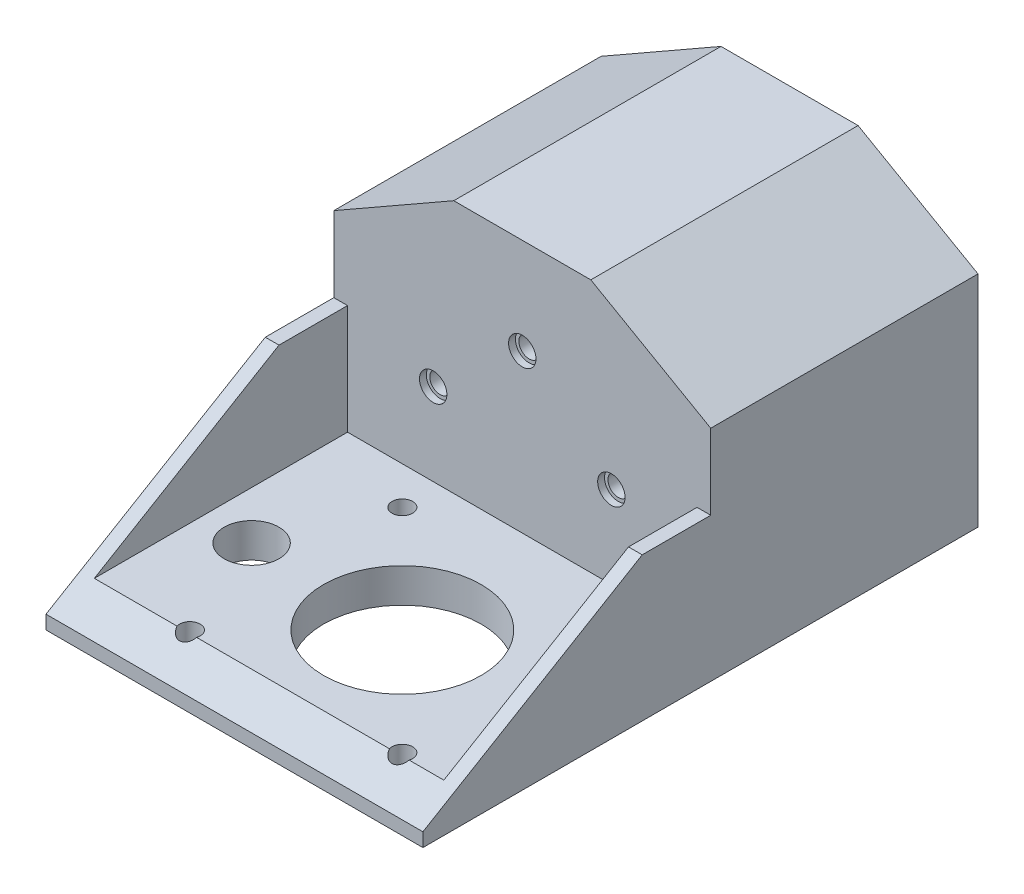
ISO-10303-21;
HEADER;
FILE_DESCRIPTION(('STEP AP214'),'2;1');
FILE_NAME('part.step','',(''),(''),'','','');
FILE_SCHEMA(('AUTOMOTIVE_DESIGN { 1 0 10303 214 1 1 1 1 }'));
ENDSEC;
DATA;
#1=APPLICATION_CONTEXT('core data for automotive mechanical design processes');
#2=APPLICATION_PROTOCOL_DEFINITION('international standard','automotive_design',2000,#1);
#3=PRODUCT_CONTEXT('',#1,'mechanical');
#4=PRODUCT('Part','Part','',(#3));
#5=PRODUCT_RELATED_PRODUCT_CATEGORY('part','',(#4));
#6=PRODUCT_DEFINITION_FORMATION('','',#4);
#7=PRODUCT_DEFINITION_CONTEXT('part definition',#1,'design');
#8=PRODUCT_DEFINITION('design','',#6,#7);
#9=PRODUCT_DEFINITION_SHAPE('','',#8);
#10=(LENGTH_UNIT() NAMED_UNIT(*) SI_UNIT(.MILLI.,.METRE.));
#11=(NAMED_UNIT(*) PLANE_ANGLE_UNIT() SI_UNIT($,.RADIAN.));
#12=(NAMED_UNIT(*) SI_UNIT($,.STERADIAN.) SOLID_ANGLE_UNIT());
#13=UNCERTAINTY_MEASURE_WITH_UNIT(LENGTH_MEASURE(1.E-05),#10,'distance_accuracy_value','');
#14=(GEOMETRIC_REPRESENTATION_CONTEXT(3) GLOBAL_UNCERTAINTY_ASSIGNED_CONTEXT((#13)) GLOBAL_UNIT_ASSIGNED_CONTEXT((#10,
#11,#12)) REPRESENTATION_CONTEXT('',''));
#15=CARTESIAN_POINT('',(0.,0.,0.));
#16=DIRECTION('',(0.,0.,1.));
#17=DIRECTION('',(1.,0.,0.));
#18=AXIS2_PLACEMENT_3D('',#15,#16,#17);
#19=CARTESIAN_POINT('',(0.,0.,39.));
#20=DIRECTION('',(0.,0.,1.));
#21=DIRECTION('',(1.,0.,0.));
#22=AXIS2_PLACEMENT_3D('',#19,#20,#21);
#23=PLANE('',#22);
#24=CARTESIAN_POINT('',(27.5000000000002,28.,39.));
#25=DIRECTION('',(0.,0.,1.));
#26=DIRECTION('',(1.,0.,0.));
#27=AXIS2_PLACEMENT_3D('',#24,#25,#26);
#28=CIRCLE('',#27,2.);
#29=CARTESIAN_POINT('',(29.5000000000002,28.,39.));
#30=VERTEX_POINT('',#29);
#31=EDGE_CURVE('E440',#30,#30,#28,.T.);
#32=ORIENTED_EDGE('',*,*,#31,.F.);
#33=EDGE_LOOP('',(#32));
#34=FACE_BOUND('',#33,.T.);
#35=CARTESIAN_POINT('',(40.5000000000002,17.,39.));
#36=DIRECTION('',(0.,0.,1.));
#37=DIRECTION('',(1.,0.,0.));
#38=AXIS2_PLACEMENT_3D('',#35,#36,#37);
#39=CIRCLE('',#38,2.);
#40=CARTESIAN_POINT('',(42.5000000000002,17.,39.));
#41=VERTEX_POINT('',#40);
#42=EDGE_CURVE('E448',#41,#41,#39,.T.);
#43=ORIENTED_EDGE('',*,*,#42,.F.);
#44=EDGE_LOOP('',(#43));
#45=FACE_BOUND('',#44,.T.);
#46=CARTESIAN_POINT('',(14.5,17.,39.));
#47=DIRECTION('',(0.,0.,1.));
#48=DIRECTION('',(1.,0.,0.));
#49=AXIS2_PLACEMENT_3D('',#46,#47,#48);
#50=CIRCLE('',#49,2.);
#51=CARTESIAN_POINT('',(16.5,17.,39.));
#52=VERTEX_POINT('',#51);
#53=EDGE_CURVE('E436',#52,#52,#50,.T.);
#54=ORIENTED_EDGE('',*,*,#53,.F.);
#55=EDGE_LOOP('',(#54));
#56=FACE_BOUND('',#55,.T.);
#57=DIRECTION('',(-1.,0.,0.));
#58=VECTOR('',#57,1.);
#59=CARTESIAN_POINT('',(55.0000000000002,5.,39.));
#60=LINE('',#59,#58);
#61=CARTESIAN_POINT('',(53.0000000000002,5.,39.));
#62=VERTEX_POINT('',#61);
#63=CARTESIAN_POINT('',(2.,4.99999999999999,39.));
#64=VERTEX_POINT('',#63);
#65=EDGE_CURVE('E180',#62,#64,#60,.T.);
#66=ORIENTED_EDGE('',*,*,#65,.F.);
#67=DIRECTION('',(0.,-1.,0.));
#68=VECTOR('',#67,1.);
#69=CARTESIAN_POINT('',(53.0000000000002,21.,39.));
#70=LINE('',#69,#68);
#71=CARTESIAN_POINT('',(53.0000000000002,21.,39.));
#72=VERTEX_POINT('',#71);
#73=EDGE_CURVE('E391',#72,#62,#70,.T.);
#74=ORIENTED_EDGE('',*,*,#73,.F.);
#75=DIRECTION('',(-1.,0.,0.));
#76=VECTOR('',#75,1.);
#77=CARTESIAN_POINT('',(55.0000000000002,21.,39.));
#78=LINE('',#77,#76);
#79=CARTESIAN_POINT('',(55.0000000000002,21.,39.));
#80=VERTEX_POINT('',#79);
#81=EDGE_CURVE('E412',#80,#72,#78,.T.);
#82=ORIENTED_EDGE('',*,*,#81,.F.);
#83=DIRECTION('',(0.,1.,0.));
#84=VECTOR('',#83,1.);
#85=CARTESIAN_POINT('',(55.0000000000002,0.,39.));
#86=LINE('',#85,#84);
#87=CARTESIAN_POINT('',(55.0000000000002,32.,39.));
#88=VERTEX_POINT('',#87);
#89=EDGE_CURVE('E98',#80,#88,#86,.T.);
#90=ORIENTED_EDGE('',*,*,#89,.T.);
#91=DIRECTION('',(-0.868243142124462,0.496138938356834,0.));
#92=VECTOR('',#91,1.);
#93=CARTESIAN_POINT('',(55.0000000000002,32.,39.));
#94=LINE('',#93,#92);
#95=CARTESIAN_POINT('',(37.5000000000002,42.,39.));
#96=VERTEX_POINT('',#95);
#97=EDGE_CURVE('E201',#88,#96,#94,.T.);
#98=ORIENTED_EDGE('',*,*,#97,.T.);
#99=DIRECTION('',(-1.,0.,0.));
#100=VECTOR('',#99,1.);
#101=CARTESIAN_POINT('',(37.5000000000002,42.,39.));
#102=LINE('',#101,#100);
#103=CARTESIAN_POINT('',(17.5,42.,39.));
#104=VERTEX_POINT('',#103);
#105=EDGE_CURVE('E204',#96,#104,#102,.T.);
#106=ORIENTED_EDGE('',*,*,#105,.T.);
#107=DIRECTION('',(-0.868243142124462,-0.496138938356834,0.));
#108=VECTOR('',#107,1.);
#109=CARTESIAN_POINT('',(17.5,42.,39.));
#110=LINE('',#109,#108);
#111=CARTESIAN_POINT('',(0.,32.,39.));
#112=VERTEX_POINT('',#111);
#113=EDGE_CURVE('E64',#104,#112,#110,.T.);
#114=ORIENTED_EDGE('',*,*,#113,.T.);
#115=DIRECTION('',(0.,-1.,0.));
#116=VECTOR('',#115,1.);
#117=CARTESIAN_POINT('',(0.,32.,39.));
#118=LINE('',#117,#116);
#119=CARTESIAN_POINT('',(0.,21.,39.));
#120=VERTEX_POINT('',#119);
#121=EDGE_CURVE('E196',#112,#120,#118,.T.);
#122=ORIENTED_EDGE('',*,*,#121,.T.);
#123=DIRECTION('',(-1.,0.,0.));
#124=VECTOR('',#123,1.);
#125=CARTESIAN_POINT('',(0.,21.,39.));
#126=LINE('',#125,#124);
#127=CARTESIAN_POINT('',(2.,21.,39.));
#128=VERTEX_POINT('',#127);
#129=EDGE_CURVE('E429',#128,#120,#126,.T.);
#130=ORIENTED_EDGE('',*,*,#129,.F.);
#131=DIRECTION('',(0.,-1.,0.));
#132=VECTOR('',#131,1.);
#133=CARTESIAN_POINT('',(2.,21.,39.));
#134=LINE('',#133,#132);
#135=EDGE_CURVE('E394',#128,#64,#134,.T.);
#136=ORIENTED_EDGE('',*,*,#135,.T.);
#137=EDGE_LOOP('',(#66,#74,#82,#90,#98,#106,#114,#122,#130,#136));
#138=FACE_BOUND('',#137,.T.);
#139=ADVANCED_FACE('F40',(#34,#45,#56,#138),#23,.T.);
#140=CARTESIAN_POINT('',(55.0000000000002,5.,81.0000000000001));
#141=DIRECTION('',(0.,-1.,0.));
#142=DIRECTION('',(1.,0.,0.));
#143=AXIS2_PLACEMENT_3D('',#140,#141,#142);
#144=PLANE('',#143);
#145=CARTESIAN_POINT('',(9.00000000000001,4.99999999999999,60.0000000000001));
#146=DIRECTION('',(0.,1.,0.));
#147=DIRECTION('',(-1.,0.,0.));
#148=AXIS2_PLACEMENT_3D('',#145,#146,#147);
#149=CIRCLE('',#148,4.00000000000001);
#150=CARTESIAN_POINT('',(4.99999999999999,4.99999999999999,60.0000000000001));
#151=VERTEX_POINT('',#150);
#152=EDGE_CURVE('E310',#151,#151,#149,.T.);
#153=ORIENTED_EDGE('',*,*,#152,.F.);
#154=EDGE_LOOP('',(#153));
#155=FACE_BOUND('',#154,.T.);
#156=DIRECTION('',(0.,0.,-1.));
#157=VECTOR('',#156,1.);
#158=CARTESIAN_POINT('',(2.,4.99999999999999,39.));
#159=LINE('',#158,#157);
#160=CARTESIAN_POINT('',(2.,4.99999999999999,75.9473684210527));
#161=VERTEX_POINT('',#160);
#162=EDGE_CURVE('E399',#161,#64,#159,.T.);
#163=ORIENTED_EDGE('',*,*,#162,.F.);
#164=DIRECTION('',(1.,0.,0.));
#165=VECTOR('',#164,1.);
#166=CARTESIAN_POINT('',(55.0000000000002,5.,75.9473684210527));
#167=LINE('',#166,#165);
#168=CARTESIAN_POINT('',(14.0682662622384,4.99999999999999,75.9473684210527));
#169=VERTEX_POINT('',#168);
#170=EDGE_CURVE('E743',#161,#169,#167,.T.);
#171=ORIENTED_EDGE('',*,*,#170,.T.);
#172=CARTESIAN_POINT('',(15.5,4.99999999999999,75.5));
#173=DIRECTION('',(0.,1.,0.));
#174=DIRECTION('',(-1.,0.,0.));
#175=AXIS2_PLACEMENT_3D('',#172,#173,#174);
#176=CIRCLE('',#175,1.5);
#177=CARTESIAN_POINT('',(16.9317337377616,4.99999999999999,75.9473684210527));
#178=VERTEX_POINT('',#177);
#179=EDGE_CURVE('E302',#178,#169,#176,.T.);
#180=ORIENTED_EDGE('',*,*,#179,.F.);
#181=CARTESIAN_POINT('',(45.0682662622385,5.,75.9473684210527));
#182=VERTEX_POINT('',#181);
#183=EDGE_CURVE('E748',#178,#182,#167,.T.);
#184=ORIENTED_EDGE('',*,*,#183,.T.);
#185=CARTESIAN_POINT('',(46.5000000000001,5.,75.5));
#186=DIRECTION('',(0.,1.,0.));
#187=DIRECTION('',(-1.,0.,0.));
#188=AXIS2_PLACEMENT_3D('',#185,#186,#187);
#189=CIRCLE('',#188,1.5);
#190=CARTESIAN_POINT('',(47.9317337377618,5.,75.9473684210527));
#191=VERTEX_POINT('',#190);
#192=EDGE_CURVE('E294',#191,#182,#189,.T.);
#193=ORIENTED_EDGE('',*,*,#192,.F.);
#194=CARTESIAN_POINT('',(53.0000000000002,5.,75.9473684210527));
#195=VERTEX_POINT('',#194);
#196=EDGE_CURVE('E404',#191,#195,#167,.T.);
#197=ORIENTED_EDGE('',*,*,#196,.T.);
#198=DIRECTION('',(0.,0.,1.));
#199=VECTOR('',#198,1.);
#200=CARTESIAN_POINT('',(53.0000000000002,5.,39.));
#201=LINE('',#200,#199);
#202=EDGE_CURVE('E402',#62,#195,#201,.T.);
#203=ORIENTED_EDGE('',*,*,#202,.F.);
#204=ORIENTED_EDGE('',*,*,#65,.T.);
#205=EDGE_LOOP('',(#163,#171,#180,#184,#193,#197,#203,#204));
#206=FACE_BOUND('',#205,.T.);
#207=CARTESIAN_POINT('',(46.5000000000001,5.,44.5));
#208=DIRECTION('',(0.,1.,0.));
#209=DIRECTION('',(-1.,0.,0.));
#210=AXIS2_PLACEMENT_3D('',#207,#208,#209);
#211=CIRCLE('',#210,1.5);
#212=CARTESIAN_POINT('',(45.0000000000001,5.,44.5));
#213=VERTEX_POINT('',#212);
#214=EDGE_CURVE('E286',#213,#213,#211,.T.);
#215=ORIENTED_EDGE('',*,*,#214,.F.);
#216=EDGE_LOOP('',(#215));
#217=FACE_BOUND('',#216,.T.);
#218=CARTESIAN_POINT('',(15.5,4.99999999999999,44.5));
#219=DIRECTION('',(0.,1.,0.));
#220=DIRECTION('',(-1.,0.,0.));
#221=AXIS2_PLACEMENT_3D('',#218,#219,#220);
#222=CIRCLE('',#221,1.5);
#223=CARTESIAN_POINT('',(14.,4.99999999999999,44.5));
#224=VERTEX_POINT('',#223);
#225=EDGE_CURVE('E278',#224,#224,#222,.T.);
#226=ORIENTED_EDGE('',*,*,#225,.F.);
#227=EDGE_LOOP('',(#226));
#228=FACE_BOUND('',#227,.T.);
#229=CARTESIAN_POINT('',(31.0000000000002,4.99999999999999,60.0000000000001));
#230=DIRECTION('',(0.,1.,0.));
#231=DIRECTION('',(-1.,0.,0.));
#232=AXIS2_PLACEMENT_3D('',#229,#230,#231);
#233=CIRCLE('',#232,11.5);
#234=CARTESIAN_POINT('',(19.5000000000001,4.99999999999999,60.0000000000001));
#235=VERTEX_POINT('',#234);
#236=EDGE_CURVE('E190',#235,#235,#233,.T.);
#237=ORIENTED_EDGE('',*,*,#236,.F.);
#238=EDGE_LOOP('',(#237));
#239=FACE_BOUND('',#238,.T.);
#240=ADVANCED_FACE('F325',(#155,#206,#217,#228,#239),#144,.F.);
#241=CARTESIAN_POINT('',(14.5,17.,0.));
#242=DIRECTION('',(0.,0.,1.));
#243=DIRECTION('',(1.,0.,0.));
#244=AXIS2_PLACEMENT_3D('',#241,#242,#243);
#245=CYLINDRICAL_SURFACE('',#244,1.5);
#246=CARTESIAN_POINT('',(14.5,17.,0.));
#247=DIRECTION('',(0.,0.,1.));
#248=DIRECTION('',(-1.,0.,0.));
#249=AXIS2_PLACEMENT_3D('',#246,#247,#248);
#250=CIRCLE('',#249,1.5);
#251=CARTESIAN_POINT('',(13.,17.,0.));
#252=VERTEX_POINT('',#251);
#253=EDGE_CURVE('E257',#252,#252,#250,.T.);
#254=ORIENTED_EDGE('',*,*,#253,.F.);
#255=EDGE_LOOP('',(#254));
#256=FACE_BOUND('',#255,.T.);
#257=CARTESIAN_POINT('',(14.5,17.,38.));
#258=DIRECTION('',(0.,0.,1.));
#259=DIRECTION('',(1.,0.,0.));
#260=AXIS2_PLACEMENT_3D('',#257,#258,#259);
#261=CIRCLE('',#260,1.5);
#262=CARTESIAN_POINT('',(16.,17.,38.));
#263=VERTEX_POINT('',#262);
#264=EDGE_CURVE('E254',#263,#263,#261,.F.);
#265=ORIENTED_EDGE('',*,*,#264,.F.);
#266=EDGE_LOOP('',(#265));
#267=FACE_BOUND('',#266,.T.);
#268=ADVANCED_FACE('F327',(#256,#267),#245,.F.);
#269=CARTESIAN_POINT('',(40.5000000000002,17.,0.));
#270=DIRECTION('',(0.,0.,1.));
#271=DIRECTION('',(1.,0.,0.));
#272=AXIS2_PLACEMENT_3D('',#269,#270,#271);
#273=CYLINDRICAL_SURFACE('',#272,1.5);
#274=CARTESIAN_POINT('',(40.5000000000002,17.,0.));
#275=DIRECTION('',(0.,0.,1.));
#276=DIRECTION('',(1.,0.,0.));
#277=AXIS2_PLACEMENT_3D('',#274,#275,#276);
#278=CIRCLE('',#277,1.5);
#279=CARTESIAN_POINT('',(42.0000000000002,17.,0.));
#280=VERTEX_POINT('',#279);
#281=EDGE_CURVE('E263',#280,#280,#278,.T.);
#282=ORIENTED_EDGE('',*,*,#281,.F.);
#283=EDGE_LOOP('',(#282));
#284=FACE_BOUND('',#283,.T.);
#285=CARTESIAN_POINT('',(40.5000000000002,17.,38.));
#286=DIRECTION('',(0.,0.,1.));
#287=DIRECTION('',(1.,0.,0.));
#288=AXIS2_PLACEMENT_3D('',#285,#286,#287);
#289=CIRCLE('',#288,1.5);
#290=CARTESIAN_POINT('',(42.0000000000002,17.,38.));
#291=VERTEX_POINT('',#290);
#292=EDGE_CURVE('E250',#291,#291,#289,.F.);
#293=ORIENTED_EDGE('',*,*,#292,.F.);
#294=EDGE_LOOP('',(#293));
#295=FACE_BOUND('',#294,.T.);
#296=ADVANCED_FACE('F334',(#284,#295),#273,.F.);
#297=CARTESIAN_POINT('',(27.5000000000002,28.,0.));
#298=DIRECTION('',(0.,0.,1.));
#299=DIRECTION('',(1.,0.,0.));
#300=AXIS2_PLACEMENT_3D('',#297,#298,#299);
#301=CYLINDRICAL_SURFACE('',#300,1.5);
#302=CARTESIAN_POINT('',(27.5000000000002,28.,0.));
#303=DIRECTION('',(0.,0.,1.));
#304=DIRECTION('',(1.,0.,0.));
#305=AXIS2_PLACEMENT_3D('',#302,#303,#304);
#306=CIRCLE('',#305,1.5);
#307=CARTESIAN_POINT('',(29.0000000000002,28.,0.));
#308=VERTEX_POINT('',#307);
#309=EDGE_CURVE('E270',#308,#308,#306,.T.);
#310=ORIENTED_EDGE('',*,*,#309,.F.);
#311=EDGE_LOOP('',(#310));
#312=FACE_BOUND('',#311,.T.);
#313=CARTESIAN_POINT('',(27.5000000000002,28.,38.));
#314=DIRECTION('',(0.,0.,1.));
#315=DIRECTION('',(1.,0.,0.));
#316=AXIS2_PLACEMENT_3D('',#313,#314,#315);
#317=CIRCLE('',#316,1.5);
#318=CARTESIAN_POINT('',(29.0000000000002,28.,38.));
#319=VERTEX_POINT('',#318);
#320=EDGE_CURVE('E246',#319,#319,#317,.F.);
#321=ORIENTED_EDGE('',*,*,#320,.F.);
#322=EDGE_LOOP('',(#321));
#323=FACE_BOUND('',#322,.T.);
#324=ADVANCED_FACE('F366',(#312,#323),#301,.F.);
#325=CARTESIAN_POINT('',(0.,32.,39.));
#326=DIRECTION('',(1.,0.,0.));
#327=DIRECTION('',(0.,1.,0.));
#328=AXIS2_PLACEMENT_3D('',#325,#326,#327);
#329=PLANE('',#328);
#330=DIRECTION('',(0.,-1.,0.));
#331=VECTOR('',#330,1.);
#332=CARTESIAN_POINT('',(0.,4.99999999999999,81.0000000000001));
#333=LINE('',#332,#331);
#334=CARTESIAN_POINT('',(0.,2.,81.0000000000001));
#335=VERTEX_POINT('',#334);
#336=CARTESIAN_POINT('',(0.,0.,81.0000000000001));
#337=VERTEX_POINT('',#336);
#338=EDGE_CURVE('E179',#335,#337,#333,.T.);
#339=ORIENTED_EDGE('',*,*,#338,.F.);
#340=DIRECTION('',(0.,0.510538754155436,-0.859854743840737));
#341=VECTOR('',#340,1.);
#342=CARTESIAN_POINT('',(0.,28.2570397111913,36.7776173285198));
#343=LINE('',#342,#341);
#344=CARTESIAN_POINT('',(0.,21.,49.));
#345=VERTEX_POINT('',#344);
#346=EDGE_CURVE('E158',#335,#345,#343,.T.);
#347=ORIENTED_EDGE('',*,*,#346,.T.);
#348=DIRECTION('',(0.,0.,1.));
#349=VECTOR('',#348,1.);
#350=CARTESIAN_POINT('',(0.,21.,39.));
#351=LINE('',#350,#349);
#352=EDGE_CURVE('E422',#120,#345,#351,.T.);
#353=ORIENTED_EDGE('',*,*,#352,.F.);
#354=ORIENTED_EDGE('',*,*,#121,.F.);
#355=DIRECTION('',(0.,0.,-1.));
#356=VECTOR('',#355,1.);
#357=CARTESIAN_POINT('',(0.,32.,39.));
#358=LINE('',#357,#356);
#359=CARTESIAN_POINT('',(0.,32.,0.));
#360=VERTEX_POINT('',#359);
#361=EDGE_CURVE('E209',#112,#360,#358,.T.);
#362=ORIENTED_EDGE('',*,*,#361,.T.);
#363=DIRECTION('',(0.,-1.,0.));
#364=VECTOR('',#363,1.);
#365=CARTESIAN_POINT('',(0.,32.,0.));
#366=LINE('',#365,#364);
#367=CARTESIAN_POINT('',(0.,0.,0.));
#368=VERTEX_POINT('',#367);
#369=EDGE_CURVE('E194',#360,#368,#366,.T.);
#370=ORIENTED_EDGE('',*,*,#369,.T.);
#371=DIRECTION('',(0.,0.,-1.));
#372=VECTOR('',#371,1.);
#373=CARTESIAN_POINT('',(0.,0.,39.));
#374=LINE('',#373,#372);
#375=EDGE_CURVE('E49',#337,#368,#374,.T.);
#376=ORIENTED_EDGE('',*,*,#375,.F.);
#377=EDGE_LOOP('',(#339,#347,#353,#354,#362,#370,#376));
#378=FACE_BOUND('',#377,.T.);
#379=ADVANCED_FACE('F42',(#378),#329,.F.);
#380=CARTESIAN_POINT('',(0.,0.,39.));
#381=DIRECTION('',(0.,1.,0.));
#382=DIRECTION('',(0.,0.,1.));
#383=AXIS2_PLACEMENT_3D('',#380,#381,#382);
#384=PLANE('',#383);
#385=CARTESIAN_POINT('',(9.00000000000001,0.,60.0000000000001));
#386=DIRECTION('',(0.,1.,0.));
#387=DIRECTION('',(-1.,0.,0.));
#388=AXIS2_PLACEMENT_3D('',#385,#386,#387);
#389=CIRCLE('',#388,4.00000000000001);
#390=CARTESIAN_POINT('',(4.99999999999999,0.,60.0000000000001));
#391=VERTEX_POINT('',#390);
#392=EDGE_CURVE('E306',#391,#391,#389,.T.);
#393=ORIENTED_EDGE('',*,*,#392,.T.);
#394=EDGE_LOOP('',(#393));
#395=FACE_BOUND('',#394,.T.);
#396=CARTESIAN_POINT('',(15.5,0.,75.5));
#397=DIRECTION('',(0.,1.,0.));
#398=DIRECTION('',(-1.,0.,0.));
#399=AXIS2_PLACEMENT_3D('',#396,#397,#398);
#400=CIRCLE('',#399,1.5);
#401=CARTESIAN_POINT('',(14.,0.,75.5));
#402=VERTEX_POINT('',#401);
#403=EDGE_CURVE('E298',#402,#402,#400,.T.);
#404=ORIENTED_EDGE('',*,*,#403,.T.);
#405=EDGE_LOOP('',(#404));
#406=FACE_BOUND('',#405,.T.);
#407=CARTESIAN_POINT('',(46.5000000000001,0.,75.5));
#408=DIRECTION('',(0.,1.,0.));
#409=DIRECTION('',(-1.,0.,0.));
#410=AXIS2_PLACEMENT_3D('',#407,#408,#409);
#411=CIRCLE('',#410,1.5);
#412=CARTESIAN_POINT('',(45.0000000000001,0.,75.5));
#413=VERTEX_POINT('',#412);
#414=EDGE_CURVE('E290',#413,#413,#411,.T.);
#415=ORIENTED_EDGE('',*,*,#414,.T.);
#416=EDGE_LOOP('',(#415));
#417=FACE_BOUND('',#416,.T.);
#418=CARTESIAN_POINT('',(46.5000000000001,0.,44.5));
#419=DIRECTION('',(0.,1.,0.));
#420=DIRECTION('',(-1.,0.,0.));
#421=AXIS2_PLACEMENT_3D('',#418,#419,#420);
#422=CIRCLE('',#421,1.5);
#423=CARTESIAN_POINT('',(45.0000000000001,0.,44.5));
#424=VERTEX_POINT('',#423);
#425=EDGE_CURVE('E282',#424,#424,#422,.T.);
#426=ORIENTED_EDGE('',*,*,#425,.T.);
#427=EDGE_LOOP('',(#426));
#428=FACE_BOUND('',#427,.T.);
#429=CARTESIAN_POINT('',(15.5,0.,44.5));
#430=DIRECTION('',(0.,1.,0.));
#431=DIRECTION('',(-1.,0.,0.));
#432=AXIS2_PLACEMENT_3D('',#429,#430,#431);
#433=CIRCLE('',#432,1.5);
#434=CARTESIAN_POINT('',(14.,0.,44.5));
#435=VERTEX_POINT('',#434);
#436=EDGE_CURVE('E274',#435,#435,#433,.T.);
#437=ORIENTED_EDGE('',*,*,#436,.T.);
#438=EDGE_LOOP('',(#437));
#439=FACE_BOUND('',#438,.T.);
#440=CARTESIAN_POINT('',(31.0000000000002,0.,60.0000000000001));
#441=DIRECTION('',(0.,1.,0.));
#442=DIRECTION('',(-1.,0.,0.));
#443=AXIS2_PLACEMENT_3D('',#440,#441,#442);
#444=CIRCLE('',#443,11.5);
#445=CARTESIAN_POINT('',(19.5000000000001,0.,60.0000000000001));
#446=VERTEX_POINT('',#445);
#447=EDGE_CURVE('E187',#446,#446,#444,.T.);
#448=ORIENTED_EDGE('',*,*,#447,.T.);
#449=EDGE_LOOP('',(#448));
#450=FACE_BOUND('',#449,.T.);
#451=DIRECTION('',(1.,0.,0.));
#452=VECTOR('',#451,1.);
#453=CARTESIAN_POINT('',(0.,0.,0.));
#454=LINE('',#453,#452);
#455=CARTESIAN_POINT('',(55.0000000000002,0.,0.));
#456=VERTEX_POINT('',#455);
#457=EDGE_CURVE('E213',#368,#456,#454,.T.);
#458=ORIENTED_EDGE('',*,*,#457,.T.);
#459=DIRECTION('',(0.,0.,-1.));
#460=VECTOR('',#459,1.);
#461=CARTESIAN_POINT('',(55.0000000000002,0.,39.));
#462=LINE('',#461,#460);
#463=CARTESIAN_POINT('',(55.0000000000002,0.,81.0000000000001));
#464=VERTEX_POINT('',#463);
#465=EDGE_CURVE('E240',#464,#456,#462,.T.);
#466=ORIENTED_EDGE('',*,*,#465,.F.);
#467=DIRECTION('',(1.,0.,0.));
#468=VECTOR('',#467,1.);
#469=CARTESIAN_POINT('',(55.0000000000002,0.,81.0000000000001));
#470=LINE('',#469,#468);
#471=EDGE_CURVE('E177',#337,#464,#470,.T.);
#472=ORIENTED_EDGE('',*,*,#471,.F.);
#473=ORIENTED_EDGE('',*,*,#375,.T.);
#474=EDGE_LOOP('',(#458,#466,#472,#473));
#475=FACE_BOUND('',#474,.T.);
#476=ADVANCED_FACE('F360',(#395,#406,#417,#428,#439,#450,#475),#384,.F.);
#477=CARTESIAN_POINT('',(55.0000000000002,0.,39.));
#478=DIRECTION('',(-1.,0.,0.));
#479=DIRECTION('',(0.,0.,1.));
#480=AXIS2_PLACEMENT_3D('',#477,#478,#479);
#481=PLANE('',#480);
#482=DIRECTION('',(0.,0.,-1.));
#483=VECTOR('',#482,1.);
#484=CARTESIAN_POINT('',(55.0000000000002,21.,39.));
#485=LINE('',#484,#483);
#486=CARTESIAN_POINT('',(55.0000000000002,21.,49.));
#487=VERTEX_POINT('',#486);
#488=EDGE_CURVE('E171',#487,#80,#485,.T.);
#489=ORIENTED_EDGE('',*,*,#488,.F.);
#490=DIRECTION('',(0.,0.510538754155436,-0.859854743840737));
#491=VECTOR('',#490,1.);
#492=CARTESIAN_POINT('',(55.0000000000002,2.,81.0000000000001));
#493=LINE('',#492,#491);
#494=CARTESIAN_POINT('',(55.0000000000002,2.,81.0000000000001));
#495=VERTEX_POINT('',#494);
#496=EDGE_CURVE('E56',#495,#487,#493,.T.);
#497=ORIENTED_EDGE('',*,*,#496,.F.);
#498=DIRECTION('',(0.,1.,0.));
#499=VECTOR('',#498,1.);
#500=CARTESIAN_POINT('',(55.0000000000002,5.,81.0000000000001));
#501=LINE('',#500,#499);
#502=EDGE_CURVE('E170',#464,#495,#501,.T.);
#503=ORIENTED_EDGE('',*,*,#502,.F.);
#504=ORIENTED_EDGE('',*,*,#465,.T.);
#505=DIRECTION('',(0.,1.,0.));
#506=VECTOR('',#505,1.);
#507=CARTESIAN_POINT('',(55.0000000000002,0.,0.));
#508=LINE('',#507,#506);
#509=CARTESIAN_POINT('',(55.0000000000002,32.,0.));
#510=VERTEX_POINT('',#509);
#511=EDGE_CURVE('E216',#456,#510,#508,.T.);
#512=ORIENTED_EDGE('',*,*,#511,.T.);
#513=DIRECTION('',(0.,0.,-1.));
#514=VECTOR('',#513,1.);
#515=CARTESIAN_POINT('',(55.0000000000002,32.,39.));
#516=LINE('',#515,#514);
#517=EDGE_CURVE('E236',#88,#510,#516,.T.);
#518=ORIENTED_EDGE('',*,*,#517,.F.);
#519=ORIENTED_EDGE('',*,*,#89,.F.);
#520=EDGE_LOOP('',(#489,#497,#503,#504,#512,#518,#519));
#521=FACE_BOUND('',#520,.T.);
#522=ADVANCED_FACE('F168',(#521),#481,.F.);
#523=CARTESIAN_POINT('',(55.0000000000002,32.,39.));
#524=DIRECTION('',(-0.496138938356835,-0.868243142124459,0.));
#525=DIRECTION('',(0.868243142124462,-0.496138938356834,0.));
#526=AXIS2_PLACEMENT_3D('',#523,#524,#525);
#527=PLANE('',#526);
#528=DIRECTION('',(-0.868243142124462,0.496138938356834,0.));
#529=VECTOR('',#528,1.);
#530=CARTESIAN_POINT('',(55.0000000000002,32.,0.));
#531=LINE('',#530,#529);
#532=CARTESIAN_POINT('',(37.5000000000002,42.,0.));
#533=VERTEX_POINT('',#532);
#534=EDGE_CURVE('E219',#510,#533,#531,.T.);
#535=ORIENTED_EDGE('',*,*,#534,.T.);
#536=DIRECTION('',(0.,0.,-1.));
#537=VECTOR('',#536,1.);
#538=CARTESIAN_POINT('',(37.5000000000002,42.,39.));
#539=LINE('',#538,#537);
#540=EDGE_CURVE('E232',#96,#533,#539,.T.);
#541=ORIENTED_EDGE('',*,*,#540,.F.);
#542=ORIENTED_EDGE('',*,*,#97,.F.);
#543=ORIENTED_EDGE('',*,*,#517,.T.);
#544=EDGE_LOOP('',(#535,#541,#542,#543));
#545=FACE_BOUND('',#544,.T.);
#546=ADVANCED_FACE('F354',(#545),#527,.F.);
#547=CARTESIAN_POINT('',(37.5000000000002,42.,39.));
#548=DIRECTION('',(0.,-1.,0.));
#549=DIRECTION('',(0.,0.,-1.));
#550=AXIS2_PLACEMENT_3D('',#547,#548,#549);
#551=PLANE('',#550);
#552=DIRECTION('',(-1.,0.,0.));
#553=VECTOR('',#552,1.);
#554=CARTESIAN_POINT('',(37.5000000000002,42.,0.));
#555=LINE('',#554,#553);
#556=CARTESIAN_POINT('',(17.5,42.,0.));
#557=VERTEX_POINT('',#556);
#558=EDGE_CURVE('E222',#533,#557,#555,.T.);
#559=ORIENTED_EDGE('',*,*,#558,.T.);
#560=DIRECTION('',(0.,0.,-1.));
#561=VECTOR('',#560,1.);
#562=CARTESIAN_POINT('',(17.5,42.,39.));
#563=LINE('',#562,#561);
#564=EDGE_CURVE('E229',#104,#557,#563,.T.);
#565=ORIENTED_EDGE('',*,*,#564,.F.);
#566=ORIENTED_EDGE('',*,*,#105,.F.);
#567=ORIENTED_EDGE('',*,*,#540,.T.);
#568=EDGE_LOOP('',(#559,#565,#566,#567));
#569=FACE_BOUND('',#568,.T.);
#570=ADVANCED_FACE('F351',(#569),#551,.F.);
#571=CARTESIAN_POINT('',(17.5,42.,39.));
#572=DIRECTION('',(0.496138938356835,-0.868243142124459,0.));
#573=DIRECTION('',(0.868243142124462,0.496138938356834,0.));
#574=AXIS2_PLACEMENT_3D('',#571,#572,#573);
#575=PLANE('',#574);
#576=DIRECTION('',(-0.868243142124462,-0.496138938356834,0.));
#577=VECTOR('',#576,1.);
#578=CARTESIAN_POINT('',(17.5,42.,0.));
#579=LINE('',#578,#577);
#580=EDGE_CURVE('E91',#557,#360,#579,.T.);
#581=ORIENTED_EDGE('',*,*,#580,.T.);
#582=ORIENTED_EDGE('',*,*,#361,.F.);
#583=ORIENTED_EDGE('',*,*,#113,.F.);
#584=ORIENTED_EDGE('',*,*,#564,.T.);
#585=EDGE_LOOP('',(#581,#582,#583,#584));
#586=FACE_BOUND('',#585,.T.);
#587=ADVANCED_FACE('F347',(#586),#575,.F.);
#588=CARTESIAN_POINT('',(0.,0.,0.));
#589=DIRECTION('',(0.,0.,1.));
#590=DIRECTION('',(1.,0.,0.));
#591=AXIS2_PLACEMENT_3D('',#588,#589,#590);
#592=PLANE('',#591);
#593=ORIENTED_EDGE('',*,*,#309,.T.);
#594=EDGE_LOOP('',(#593));
#595=FACE_BOUND('',#594,.T.);
#596=ORIENTED_EDGE('',*,*,#281,.T.);
#597=EDGE_LOOP('',(#596));
#598=FACE_BOUND('',#597,.T.);
#599=ORIENTED_EDGE('',*,*,#253,.T.);
#600=EDGE_LOOP('',(#599));
#601=FACE_BOUND('',#600,.T.);
#602=ORIENTED_EDGE('',*,*,#369,.F.);
#603=ORIENTED_EDGE('',*,*,#580,.F.);
#604=ORIENTED_EDGE('',*,*,#558,.F.);
#605=ORIENTED_EDGE('',*,*,#534,.F.);
#606=ORIENTED_EDGE('',*,*,#511,.F.);
#607=ORIENTED_EDGE('',*,*,#457,.F.);
#608=EDGE_LOOP('',(#602,#603,#604,#605,#606,#607));
#609=FACE_BOUND('',#608,.T.);
#610=ADVANCED_FACE('F344',(#595,#598,#601,#609),#592,.F.);
#611=CARTESIAN_POINT('',(0.,0.,81.0000000000001));
#612=DIRECTION('',(0.,0.,-1.));
#613=DIRECTION('',(-1.,0.,0.));
#614=AXIS2_PLACEMENT_3D('',#611,#612,#613);
#615=PLANE('',#614);
#616=ORIENTED_EDGE('',*,*,#502,.T.);
#617=DIRECTION('',(1.,0.,0.));
#618=VECTOR('',#617,1.);
#619=CARTESIAN_POINT('',(-15.,2.,81.0000000000001));
#620=LINE('',#619,#618);
#621=EDGE_CURVE('E155',#335,#495,#620,.T.);
#622=ORIENTED_EDGE('',*,*,#621,.F.);
#623=ORIENTED_EDGE('',*,*,#338,.T.);
#624=ORIENTED_EDGE('',*,*,#471,.T.);
#625=EDGE_LOOP('',(#616,#622,#623,#624));
#626=FACE_BOUND('',#625,.T.);
#627=ADVANCED_FACE('F175',(#626),#615,.F.);
#628=CARTESIAN_POINT('',(31.0000000000002,0.,60.0000000000001));
#629=DIRECTION('',(0.,1.,0.));
#630=DIRECTION('',(-1.,0.,0.));
#631=AXIS2_PLACEMENT_3D('',#628,#629,#630);
#632=CYLINDRICAL_SURFACE('',#631,11.5);
#633=ORIENTED_EDGE('',*,*,#447,.F.);
#634=EDGE_LOOP('',(#633));
#635=FACE_BOUND('',#634,.T.);
#636=ORIENTED_EDGE('',*,*,#236,.T.);
#637=EDGE_LOOP('',(#636));
#638=FACE_BOUND('',#637,.T.);
#639=ADVANCED_FACE('F323',(#635,#638),#632,.F.);
#640=CARTESIAN_POINT('',(15.5,0.,44.5));
#641=DIRECTION('',(0.,1.,0.));
#642=DIRECTION('',(-1.,0.,0.));
#643=AXIS2_PLACEMENT_3D('',#640,#641,#642);
#644=CYLINDRICAL_SURFACE('',#643,1.5);
#645=ORIENTED_EDGE('',*,*,#436,.F.);
#646=EDGE_LOOP('',(#645));
#647=FACE_BOUND('',#646,.T.);
#648=ORIENTED_EDGE('',*,*,#225,.T.);
#649=EDGE_LOOP('',(#648));
#650=FACE_BOUND('',#649,.T.);
#651=ADVANCED_FACE('F507',(#647,#650),#644,.F.);
#652=CARTESIAN_POINT('',(46.5000000000001,0.,44.5));
#653=DIRECTION('',(0.,1.,0.));
#654=DIRECTION('',(-1.,0.,0.));
#655=AXIS2_PLACEMENT_3D('',#652,#653,#654);
#656=CYLINDRICAL_SURFACE('',#655,1.5);
#657=ORIENTED_EDGE('',*,*,#425,.F.);
#658=EDGE_LOOP('',(#657));
#659=FACE_BOUND('',#658,.T.);
#660=ORIENTED_EDGE('',*,*,#214,.T.);
#661=EDGE_LOOP('',(#660));
#662=FACE_BOUND('',#661,.T.);
#663=ADVANCED_FACE('F510',(#659,#662),#656,.F.);
#664=CARTESIAN_POINT('',(46.5000000000001,0.,75.5));
#665=DIRECTION('',(0.,1.,0.));
#666=DIRECTION('',(-1.,0.,0.));
#667=AXIS2_PLACEMENT_3D('',#664,#665,#666);
#668=CYLINDRICAL_SURFACE('',#667,1.5);
#669=ORIENTED_EDGE('',*,*,#414,.F.);
#670=EDGE_LOOP('',(#669));
#671=FACE_BOUND('',#670,.T.);
#672=ORIENTED_EDGE('',*,*,#192,.T.);
#673=CARTESIAN_POINT('',(46.5000000000001,5.265625,75.5));
#674=DIRECTION('',(0.,-0.859854743840735,-0.510538754155437));
#675=DIRECTION('',(0.,0.510538754155436,-0.859854743840737));
#676=AXIS2_PLACEMENT_3D('',#673,#674,#675);
#677=ELLIPSE('',#676,1.74448069368079,1.5);
#678=EDGE_CURVE('E749',#182,#191,#677,.F.);
#679=ORIENTED_EDGE('',*,*,#678,.T.);
#680=EDGE_LOOP('',(#672,#679));
#681=FACE_BOUND('',#680,.T.);
#682=ADVANCED_FACE('F514',(#671,#681),#668,.F.);
#683=CARTESIAN_POINT('',(15.5,0.,75.5));
#684=DIRECTION('',(0.,1.,0.));
#685=DIRECTION('',(-1.,0.,0.));
#686=AXIS2_PLACEMENT_3D('',#683,#684,#685);
#687=CYLINDRICAL_SURFACE('',#686,1.5);
#688=ORIENTED_EDGE('',*,*,#403,.F.);
#689=EDGE_LOOP('',(#688));
#690=FACE_BOUND('',#689,.T.);
#691=ORIENTED_EDGE('',*,*,#179,.T.);
#692=CARTESIAN_POINT('',(15.5,5.265625,75.5));
#693=DIRECTION('',(0.,-0.859854743840735,-0.510538754155437));
#694=DIRECTION('',(0.,0.510538754155436,-0.859854743840737));
#695=AXIS2_PLACEMENT_3D('',#692,#693,#694);
#696=ELLIPSE('',#695,1.74448069368079,1.5);
#697=EDGE_CURVE('E744',#169,#178,#696,.F.);
#698=ORIENTED_EDGE('',*,*,#697,.T.);
#699=EDGE_LOOP('',(#691,#698));
#700=FACE_BOUND('',#699,.T.);
#701=ADVANCED_FACE('F482',(#690,#700),#687,.F.);
#702=CARTESIAN_POINT('',(9.00000000000001,0.,60.0000000000001));
#703=DIRECTION('',(0.,1.,0.));
#704=DIRECTION('',(-1.,0.,0.));
#705=AXIS2_PLACEMENT_3D('',#702,#703,#704);
#706=CYLINDRICAL_SURFACE('',#705,4.00000000000001);
#707=ORIENTED_EDGE('',*,*,#392,.F.);
#708=EDGE_LOOP('',(#707));
#709=FACE_BOUND('',#708,.T.);
#710=ORIENTED_EDGE('',*,*,#152,.T.);
#711=EDGE_LOOP('',(#710));
#712=FACE_BOUND('',#711,.T.);
#713=ADVANCED_FACE('F472',(#709,#712),#706,.F.);
#714=CARTESIAN_POINT('',(27.5000000000002,28.,38.));
#715=DIRECTION('',(0.,0.,1.));
#716=DIRECTION('',(1.,0.,0.));
#717=AXIS2_PLACEMENT_3D('',#714,#715,#716);
#718=PLANE('',#717);
#719=CARTESIAN_POINT('',(27.5000000000002,28.,38.));
#720=DIRECTION('',(0.,0.,1.));
#721=DIRECTION('',(1.,0.,0.));
#722=AXIS2_PLACEMENT_3D('',#719,#720,#721);
#723=CIRCLE('',#722,2.);
#724=CARTESIAN_POINT('',(29.5000000000002,28.,38.));
#725=VERTEX_POINT('',#724);
#726=EDGE_CURVE('E251',#725,#725,#723,.T.);
#727=ORIENTED_EDGE('',*,*,#726,.T.);
#728=EDGE_LOOP('',(#727));
#729=FACE_BOUND('',#728,.T.);
#730=ORIENTED_EDGE('',*,*,#320,.T.);
#731=EDGE_LOOP('',(#730));
#732=FACE_BOUND('',#731,.T.);
#733=ADVANCED_FACE('F469',(#729,#732),#718,.T.);
#734=CARTESIAN_POINT('',(27.5000000000002,28.,38.));
#735=DIRECTION('',(0.,0.,1.));
#736=DIRECTION('',(1.,0.,0.));
#737=AXIS2_PLACEMENT_3D('',#734,#735,#736);
#738=CYLINDRICAL_SURFACE('',#737,2.);
#739=ORIENTED_EDGE('',*,*,#726,.F.);
#740=EDGE_LOOP('',(#739));
#741=FACE_BOUND('',#740,.T.);
#742=ORIENTED_EDGE('',*,*,#31,.T.);
#743=EDGE_LOOP('',(#742));
#744=FACE_BOUND('',#743,.T.);
#745=ADVANCED_FACE('F471',(#741,#744),#738,.F.);
#746=CARTESIAN_POINT('',(40.5000000000002,17.,38.));
#747=DIRECTION('',(0.,0.,1.));
#748=DIRECTION('',(1.,0.,0.));
#749=AXIS2_PLACEMENT_3D('',#746,#747,#748);
#750=PLANE('',#749);
#751=CARTESIAN_POINT('',(40.5000000000002,17.,38.));
#752=DIRECTION('',(0.,0.,1.));
#753=DIRECTION('',(1.,0.,0.));
#754=AXIS2_PLACEMENT_3D('',#751,#752,#753);
#755=CIRCLE('',#754,2.);
#756=CARTESIAN_POINT('',(42.5000000000002,17.,38.));
#757=VERTEX_POINT('',#756);
#758=EDGE_CURVE('E444',#757,#757,#755,.T.);
#759=ORIENTED_EDGE('',*,*,#758,.T.);
#760=EDGE_LOOP('',(#759));
#761=FACE_BOUND('',#760,.T.);
#762=ORIENTED_EDGE('',*,*,#292,.T.);
#763=EDGE_LOOP('',(#762));
#764=FACE_BOUND('',#763,.T.);
#765=ADVANCED_FACE('F479',(#761,#764),#750,.T.);
#766=CARTESIAN_POINT('',(40.5000000000002,17.,38.));
#767=DIRECTION('',(0.,0.,1.));
#768=DIRECTION('',(1.,0.,0.));
#769=AXIS2_PLACEMENT_3D('',#766,#767,#768);
#770=CYLINDRICAL_SURFACE('',#769,2.);
#771=ORIENTED_EDGE('',*,*,#758,.F.);
#772=EDGE_LOOP('',(#771));
#773=FACE_BOUND('',#772,.T.);
#774=ORIENTED_EDGE('',*,*,#42,.T.);
#775=EDGE_LOOP('',(#774));
#776=FACE_BOUND('',#775,.T.);
#777=ADVANCED_FACE('F491',(#773,#776),#770,.F.);
#778=CARTESIAN_POINT('',(14.5,17.,38.));
#779=DIRECTION('',(0.,0.,1.));
#780=DIRECTION('',(1.,0.,0.));
#781=AXIS2_PLACEMENT_3D('',#778,#779,#780);
#782=PLANE('',#781);
#783=CARTESIAN_POINT('',(14.5,17.,38.));
#784=DIRECTION('',(0.,0.,1.));
#785=DIRECTION('',(1.,0.,0.));
#786=AXIS2_PLACEMENT_3D('',#783,#784,#785);
#787=CIRCLE('',#786,2.);
#788=CARTESIAN_POINT('',(16.5,17.,38.));
#789=VERTEX_POINT('',#788);
#790=EDGE_CURVE('E452',#789,#789,#787,.T.);
#791=ORIENTED_EDGE('',*,*,#790,.T.);
#792=EDGE_LOOP('',(#791));
#793=FACE_BOUND('',#792,.T.);
#794=ORIENTED_EDGE('',*,*,#264,.T.);
#795=EDGE_LOOP('',(#794));
#796=FACE_BOUND('',#795,.T.);
#797=ADVANCED_FACE('F495',(#793,#796),#782,.T.);
#798=CARTESIAN_POINT('',(14.5,17.,38.));
#799=DIRECTION('',(0.,0.,1.));
#800=DIRECTION('',(1.,0.,0.));
#801=AXIS2_PLACEMENT_3D('',#798,#799,#800);
#802=CYLINDRICAL_SURFACE('',#801,2.);
#803=ORIENTED_EDGE('',*,*,#790,.F.);
#804=EDGE_LOOP('',(#803));
#805=FACE_BOUND('',#804,.T.);
#806=ORIENTED_EDGE('',*,*,#53,.T.);
#807=EDGE_LOOP('',(#806));
#808=FACE_BOUND('',#807,.T.);
#809=ADVANCED_FACE('F499',(#805,#808),#802,.F.);
#810=CARTESIAN_POINT('',(2.,21.,39.));
#811=DIRECTION('',(-1.,0.,0.));
#812=DIRECTION('',(0.,-1.,0.));
#813=AXIS2_PLACEMENT_3D('',#810,#811,#812);
#814=PLANE('',#813);
#815=DIRECTION('',(0.,0.,-1.));
#816=VECTOR('',#815,1.);
#817=CARTESIAN_POINT('',(2.,21.,39.));
#818=LINE('',#817,#816);
#819=CARTESIAN_POINT('',(2.,21.,49.));
#820=VERTEX_POINT('',#819);
#821=EDGE_CURVE('E426',#820,#128,#818,.T.);
#822=ORIENTED_EDGE('',*,*,#821,.F.);
#823=DIRECTION('',(0.,-0.510538754155436,0.859854743840737));
#824=VECTOR('',#823,1.);
#825=CARTESIAN_POINT('',(2.,25.3898916967509,41.6064981949459));
#826=LINE('',#825,#824);
#827=EDGE_CURVE('E414',#820,#161,#826,.T.);
#828=ORIENTED_EDGE('',*,*,#827,.T.);
#829=ORIENTED_EDGE('',*,*,#162,.T.);
#830=ORIENTED_EDGE('',*,*,#135,.F.);
#831=EDGE_LOOP('',(#822,#828,#829,#830));
#832=FACE_BOUND('',#831,.T.);
#833=ADVANCED_FACE('F486',(#832),#814,.F.);
#834=CARTESIAN_POINT('',(0.,21.,0.));
#835=DIRECTION('',(0.,1.,0.));
#836=DIRECTION('',(0.,0.,1.));
#837=AXIS2_PLACEMENT_3D('',#834,#835,#836);
#838=PLANE('',#837);
#839=DIRECTION('',(1.,0.,0.));
#840=VECTOR('',#839,1.);
#841=CARTESIAN_POINT('',(-15.,21.,49.));
#842=LINE('',#841,#840);
#843=EDGE_CURVE('E163',#345,#820,#842,.T.);
#844=ORIENTED_EDGE('',*,*,#843,.T.);
#845=ORIENTED_EDGE('',*,*,#821,.T.);
#846=ORIENTED_EDGE('',*,*,#129,.T.);
#847=ORIENTED_EDGE('',*,*,#352,.T.);
#848=EDGE_LOOP('',(#844,#845,#846,#847));
#849=FACE_BOUND('',#848,.T.);
#850=ADVANCED_FACE('F690',(#849),#838,.T.);
#851=CARTESIAN_POINT('',(53.0000000000002,21.,39.));
#852=DIRECTION('',(1.,0.,0.));
#853=DIRECTION('',(0.,1.,0.));
#854=AXIS2_PLACEMENT_3D('',#851,#852,#853);
#855=PLANE('',#854);
#856=ORIENTED_EDGE('',*,*,#202,.T.);
#857=DIRECTION('',(0.,0.510538754155436,-0.859854743840737));
#858=VECTOR('',#857,1.);
#859=CARTESIAN_POINT('',(53.0000000000002,25.3898916967509,41.6064981949459));
#860=LINE('',#859,#858);
#861=CARTESIAN_POINT('',(53.0000000000002,21.,49.));
#862=VERTEX_POINT('',#861);
#863=EDGE_CURVE('E755',#195,#862,#860,.T.);
#864=ORIENTED_EDGE('',*,*,#863,.T.);
#865=DIRECTION('',(0.,0.,1.));
#866=VECTOR('',#865,1.);
#867=CARTESIAN_POINT('',(53.0000000000002,21.,39.));
#868=LINE('',#867,#866);
#869=EDGE_CURVE('E418',#72,#862,#868,.T.);
#870=ORIENTED_EDGE('',*,*,#869,.F.);
#871=ORIENTED_EDGE('',*,*,#73,.T.);
#872=EDGE_LOOP('',(#856,#864,#870,#871));
#873=FACE_BOUND('',#872,.T.);
#874=ADVANCED_FACE('F698',(#873),#855,.F.);
#875=CARTESIAN_POINT('',(0.,21.,0.));
#876=DIRECTION('',(0.,-1.,0.));
#877=DIRECTION('',(1.,0.,0.));
#878=AXIS2_PLACEMENT_3D('',#875,#876,#877);
#879=PLANE('',#878);
#880=ORIENTED_EDGE('',*,*,#869,.T.);
#881=DIRECTION('',(1.,0.,0.));
#882=VECTOR('',#881,1.);
#883=CARTESIAN_POINT('',(0.,21.,49.));
#884=LINE('',#883,#882);
#885=EDGE_CURVE('E11',#862,#487,#884,.T.);
#886=ORIENTED_EDGE('',*,*,#885,.T.);
#887=ORIENTED_EDGE('',*,*,#488,.T.);
#888=ORIENTED_EDGE('',*,*,#81,.T.);
#889=EDGE_LOOP('',(#880,#886,#887,#888));
#890=FACE_BOUND('',#889,.T.);
#891=ADVANCED_FACE('F706',(#890),#879,.F.);
#892=CARTESIAN_POINT('',(-15.,2.,81.0000000000001));
#893=DIRECTION('',(0.,-0.859854743840735,-0.510538754155437));
#894=DIRECTION('',(0.,0.510538754155436,-0.859854743840737));
#895=AXIS2_PLACEMENT_3D('',#892,#893,#894);
#896=PLANE('',#895);
#897=ORIENTED_EDGE('',*,*,#621,.T.);
#898=ORIENTED_EDGE('',*,*,#496,.T.);
#899=ORIENTED_EDGE('',*,*,#885,.F.);
#900=ORIENTED_EDGE('',*,*,#863,.F.);
#901=ORIENTED_EDGE('',*,*,#196,.F.);
#902=ORIENTED_EDGE('',*,*,#678,.F.);
#903=ORIENTED_EDGE('',*,*,#183,.F.);
#904=ORIENTED_EDGE('',*,*,#697,.F.);
#905=ORIENTED_EDGE('',*,*,#170,.F.);
#906=ORIENTED_EDGE('',*,*,#827,.F.);
#907=ORIENTED_EDGE('',*,*,#843,.F.);
#908=ORIENTED_EDGE('',*,*,#346,.F.);
#909=EDGE_LOOP('',(#897,#898,#899,#900,#901,#902,#903,#904,#905,#906,#907,#908));
#910=FACE_BOUND('',#909,.T.);
#911=ADVANCED_FACE('F156',(#910),#896,.F.);
#912=CLOSED_SHELL('',(#139,#240,#268,#296,#324,#379,#476,#522,#546,#570,#587,#610,#627,#639,
#651,#663,#682,#701,#713,#733,#745,#765,#777,#797,#809,#833,#850,#874,#891,#911));
#913=MANIFOLD_SOLID_BREP('B2',#912);
#914=ADVANCED_BREP_SHAPE_REPRESENTATION('',(#18,#913),#14);
#915=SHAPE_DEFINITION_REPRESENTATION(#9,#914);
ENDSEC;
END-ISO-10303-21;
